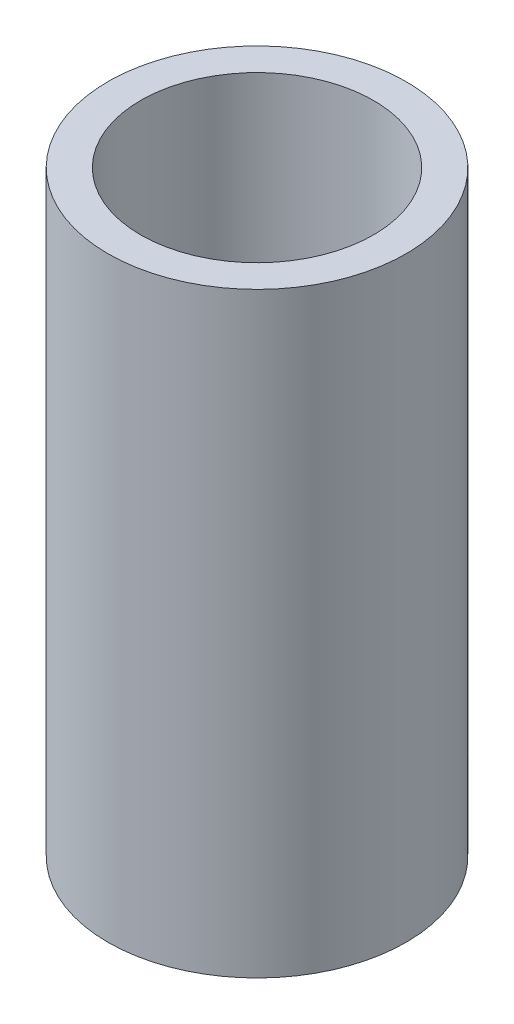
ISO-10303-21;
HEADER;
FILE_DESCRIPTION(('STEP AP214'),'2;1');
FILE_NAME('part.step','',(''),(''),'','','');
FILE_SCHEMA(('AUTOMOTIVE_DESIGN { 1 0 10303 214 1 1 1 1 }'));
ENDSEC;
DATA;
#1=APPLICATION_CONTEXT('core data for automotive mechanical design processes');
#2=APPLICATION_PROTOCOL_DEFINITION('international standard','automotive_design',2000,#1);
#3=PRODUCT_CONTEXT('',#1,'mechanical');
#4=PRODUCT('Part','Part','',(#3));
#5=PRODUCT_RELATED_PRODUCT_CATEGORY('part','',(#4));
#6=PRODUCT_DEFINITION_FORMATION('','',#4);
#7=PRODUCT_DEFINITION_CONTEXT('part definition',#1,'design');
#8=PRODUCT_DEFINITION('design','',#6,#7);
#9=PRODUCT_DEFINITION_SHAPE('','',#8);
#10=(LENGTH_UNIT() NAMED_UNIT(*) SI_UNIT(.MILLI.,.METRE.));
#11=(NAMED_UNIT(*) PLANE_ANGLE_UNIT() SI_UNIT($,.RADIAN.));
#12=(NAMED_UNIT(*) SI_UNIT($,.STERADIAN.) SOLID_ANGLE_UNIT());
#13=UNCERTAINTY_MEASURE_WITH_UNIT(LENGTH_MEASURE(1.E-05),#10,'distance_accuracy_value','');
#14=(GEOMETRIC_REPRESENTATION_CONTEXT(3) GLOBAL_UNCERTAINTY_ASSIGNED_CONTEXT((#13)) GLOBAL_UNIT_ASSIGNED_CONTEXT((#10,
#11,#12)) REPRESENTATION_CONTEXT('',''));
#15=CARTESIAN_POINT('',(0.,0.,0.));
#16=DIRECTION('',(0.,0.,1.));
#17=DIRECTION('',(1.,0.,0.));
#18=AXIS2_PLACEMENT_3D('',#15,#16,#17);
#19=CARTESIAN_POINT('',(0.,-20.32,0.));
#20=DIRECTION('',(0.,1.,0.));
#21=DIRECTION('',(0.,0.,1.));
#22=AXIS2_PLACEMENT_3D('',#19,#20,#21);
#23=CYLINDRICAL_SURFACE('',#22,5.08);
#24=CARTESIAN_POINT('',(0.,-20.32,0.));
#25=DIRECTION('',(0.,1.,0.));
#26=DIRECTION('',(0.,0.,1.));
#27=AXIS2_PLACEMENT_3D('',#24,#25,#26);
#28=CIRCLE('',#27,5.08);
#29=CARTESIAN_POINT('',(0.,-20.32,5.08));
#30=VERTEX_POINT('',#29);
#31=EDGE_CURVE('E10',#30,#30,#28,.T.);
#32=ORIENTED_EDGE('',*,*,#31,.T.);
#33=EDGE_LOOP('',(#32));
#34=FACE_BOUND('',#33,.T.);
#35=CARTESIAN_POINT('',(0.,0.,0.));
#36=DIRECTION('',(0.,1.,0.));
#37=DIRECTION('',(0.,0.,1.));
#38=AXIS2_PLACEMENT_3D('',#35,#36,#37);
#39=CIRCLE('',#38,5.08);
#40=CARTESIAN_POINT('',(0.,0.,5.08));
#41=VERTEX_POINT('',#40);
#42=EDGE_CURVE('E40',#41,#41,#39,.T.);
#43=ORIENTED_EDGE('',*,*,#42,.F.);
#44=EDGE_LOOP('',(#43));
#45=FACE_BOUND('',#44,.T.);
#46=ADVANCED_FACE('F37',(#34,#45),#23,.T.);
#47=CARTESIAN_POINT('',(0.,-20.32,0.));
#48=DIRECTION('',(0.,1.,0.));
#49=DIRECTION('',(0.,0.,1.));
#50=AXIS2_PLACEMENT_3D('',#47,#48,#49);
#51=PLANE('',#50);
#52=CARTESIAN_POINT('',(0.,-20.32,0.));
#53=DIRECTION('',(0.,1.,0.));
#54=DIRECTION('',(0.,0.,1.));
#55=AXIS2_PLACEMENT_3D('',#52,#53,#54);
#56=CIRCLE('',#55,3.96875);
#57=CARTESIAN_POINT('',(0.,-20.32,3.96875));
#58=VERTEX_POINT('',#57);
#59=EDGE_CURVE('E49',#58,#58,#56,.T.);
#60=ORIENTED_EDGE('',*,*,#59,.T.);
#61=EDGE_LOOP('',(#60));
#62=FACE_BOUND('',#61,.T.);
#63=ORIENTED_EDGE('',*,*,#31,.F.);
#64=EDGE_LOOP('',(#63));
#65=FACE_BOUND('',#64,.T.);
#66=ADVANCED_FACE('F59',(#62,#65),#51,.F.);
#67=CARTESIAN_POINT('',(0.,0.,0.));
#68=DIRECTION('',(0.,1.,0.));
#69=DIRECTION('',(0.,0.,1.));
#70=AXIS2_PLACEMENT_3D('',#67,#68,#69);
#71=PLANE('',#70);
#72=CARTESIAN_POINT('',(0.,0.,0.));
#73=DIRECTION('',(0.,1.,0.));
#74=DIRECTION('',(0.,0.,1.));
#75=AXIS2_PLACEMENT_3D('',#72,#73,#74);
#76=CIRCLE('',#75,3.96875);
#77=CARTESIAN_POINT('',(0.,0.,3.96875));
#78=VERTEX_POINT('',#77);
#79=EDGE_CURVE('E51',#78,#78,#76,.T.);
#80=ORIENTED_EDGE('',*,*,#79,.F.);
#81=EDGE_LOOP('',(#80));
#82=FACE_BOUND('',#81,.T.);
#83=ORIENTED_EDGE('',*,*,#42,.T.);
#84=EDGE_LOOP('',(#83));
#85=FACE_BOUND('',#84,.T.);
#86=ADVANCED_FACE('F65',(#82,#85),#71,.T.);
#87=CARTESIAN_POINT('',(0.,-20.32,0.));
#88=DIRECTION('',(0.,1.,0.));
#89=DIRECTION('',(0.,0.,1.));
#90=AXIS2_PLACEMENT_3D('',#87,#88,#89);
#91=CYLINDRICAL_SURFACE('',#90,3.96875);
#92=ORIENTED_EDGE('',*,*,#59,.F.);
#93=EDGE_LOOP('',(#92));
#94=FACE_BOUND('',#93,.T.);
#95=ORIENTED_EDGE('',*,*,#79,.T.);
#96=EDGE_LOOP('',(#95));
#97=FACE_BOUND('',#96,.T.);
#98=ADVANCED_FACE('F62',(#94,#97),#91,.F.);
#99=CLOSED_SHELL('',(#46,#66,#86,#98));
#100=MANIFOLD_SOLID_BREP('B2',#99);
#101=ADVANCED_BREP_SHAPE_REPRESENTATION('',(#18,#100),#14);
#102=SHAPE_DEFINITION_REPRESENTATION(#9,#101);
ENDSEC;
END-ISO-10303-21;
